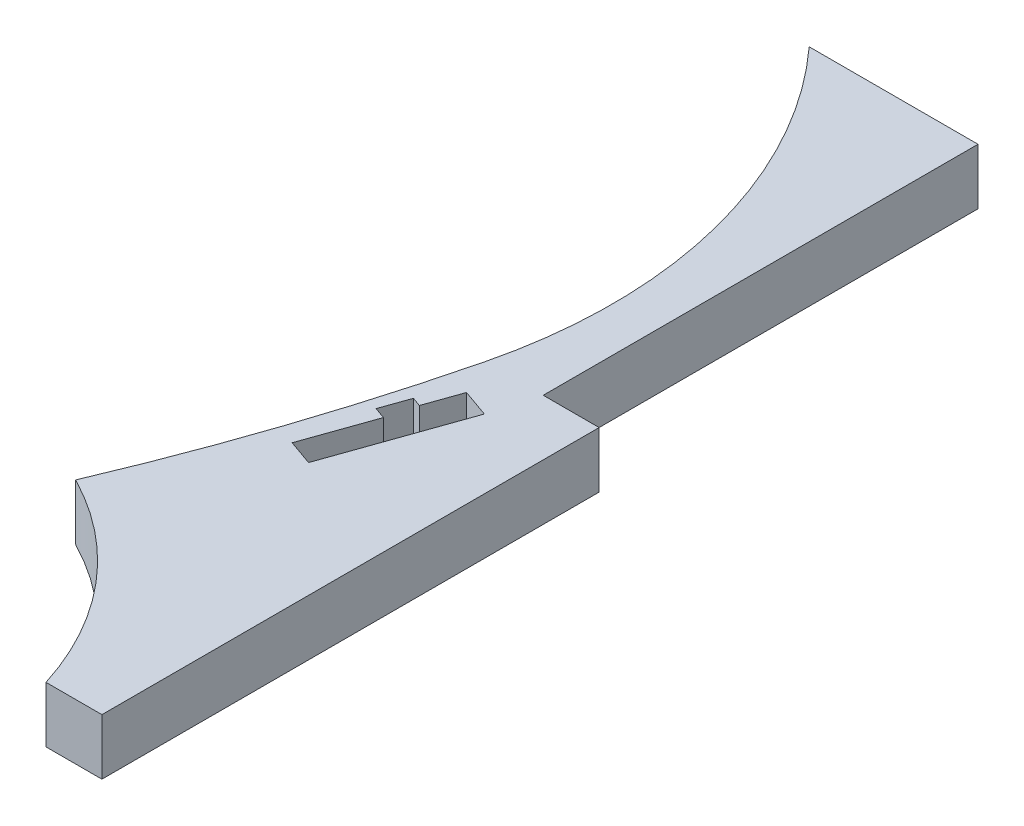
ISO-10303-21;
HEADER;
FILE_DESCRIPTION(('STEP AP214'),'2;1');
FILE_NAME('part.step','',(''),(''),'','','');
FILE_SCHEMA(('AUTOMOTIVE_DESIGN { 1 0 10303 214 1 1 1 1 }'));
ENDSEC;
DATA;
#1=APPLICATION_CONTEXT('core data for automotive mechanical design processes');
#2=APPLICATION_PROTOCOL_DEFINITION('international standard','automotive_design',2000,#1);
#3=PRODUCT_CONTEXT('',#1,'mechanical');
#4=PRODUCT('Part','Part','',(#3));
#5=PRODUCT_RELATED_PRODUCT_CATEGORY('part','',(#4));
#6=PRODUCT_DEFINITION_FORMATION('','',#4);
#7=PRODUCT_DEFINITION_CONTEXT('part definition',#1,'design');
#8=PRODUCT_DEFINITION('design','',#6,#7);
#9=PRODUCT_DEFINITION_SHAPE('','',#8);
#10=(LENGTH_UNIT() NAMED_UNIT(*) SI_UNIT(.MILLI.,.METRE.));
#11=(NAMED_UNIT(*) PLANE_ANGLE_UNIT() SI_UNIT($,.RADIAN.));
#12=(NAMED_UNIT(*) SI_UNIT($,.STERADIAN.) SOLID_ANGLE_UNIT());
#13=UNCERTAINTY_MEASURE_WITH_UNIT(LENGTH_MEASURE(1.E-05),#10,'distance_accuracy_value','');
#14=(GEOMETRIC_REPRESENTATION_CONTEXT(3) GLOBAL_UNCERTAINTY_ASSIGNED_CONTEXT((#13)) GLOBAL_UNIT_ASSIGNED_CONTEXT((#10,
#11,#12)) REPRESENTATION_CONTEXT('',''));
#15=CARTESIAN_POINT('',(0.,0.,0.));
#16=DIRECTION('',(0.,0.,1.));
#17=DIRECTION('',(1.,0.,0.));
#18=AXIS2_PLACEMENT_3D('',#15,#16,#17);
#19=CARTESIAN_POINT('',(-123.824999999997,19.05,32.9878065635989));
#20=DIRECTION('',(0.,-1.,0.));
#21=DIRECTION('',(0.,0.,-1.));
#22=AXIS2_PLACEMENT_3D('',#19,#20,#21);
#23=CYLINDRICAL_SURFACE('',#22,109.845327651549);
#24=CARTESIAN_POINT('',(-123.824999999997,0.,32.9878065635989));
#25=DIRECTION('',(0.,-1.,0.));
#26=DIRECTION('',(0.,0.,-1.));
#27=AXIS2_PLACEMENT_3D('',#24,#25,#26);
#28=CIRCLE('',#27,109.845327651549);
#29=CARTESIAN_POINT('',(-73.7224108953443,0.,-64.7655901645279));
#30=VERTEX_POINT('',#29);
#31=CARTESIAN_POINT('',(-19.0500000000028,0.,0.));
#32=VERTEX_POINT('',#31);
#33=EDGE_CURVE('E226',#30,#32,#28,.T.);
#34=ORIENTED_EDGE('',*,*,#33,.T.);
#35=DIRECTION('',(0.,-1.,0.));
#36=VECTOR('',#35,1.);
#37=CARTESIAN_POINT('',(-19.0500000000028,19.05,0.));
#38=LINE('',#37,#36);
#39=CARTESIAN_POINT('',(-19.0500000000028,19.05,0.));
#40=VERTEX_POINT('',#39);
#41=EDGE_CURVE('E11',#40,#32,#38,.T.);
#42=ORIENTED_EDGE('',*,*,#41,.F.);
#43=CARTESIAN_POINT('',(-123.824999999997,19.05,32.9878065635989));
#44=DIRECTION('',(0.,-1.,0.));
#45=DIRECTION('',(0.,0.,-1.));
#46=AXIS2_PLACEMENT_3D('',#43,#44,#45);
#47=CIRCLE('',#46,109.845327651549);
#48=CARTESIAN_POINT('',(-73.7224108953443,19.05,-64.7655901645279));
#49=VERTEX_POINT('',#48);
#50=EDGE_CURVE('E240',#49,#40,#47,.T.);
#51=ORIENTED_EDGE('',*,*,#50,.F.);
#52=DIRECTION('',(0.,-1.,0.));
#53=VECTOR('',#52,1.);
#54=CARTESIAN_POINT('',(-73.7224108953443,19.05,-64.7655901645279));
#55=LINE('',#54,#53);
#56=EDGE_CURVE('E258',#49,#30,#55,.T.);
#57=ORIENTED_EDGE('',*,*,#56,.T.);
#58=EDGE_LOOP('',(#34,#42,#51,#57));
#59=FACE_BOUND('',#58,.T.);
#60=ADVANCED_FACE('F33',(#59),#23,.F.);
#61=CARTESIAN_POINT('',(-19.0500000000028,19.05,0.));
#62=DIRECTION('',(0.,0.,-1.));
#63=DIRECTION('',(-1.,0.,0.));
#64=AXIS2_PLACEMENT_3D('',#61,#62,#63);
#65=PLANE('',#64);
#66=DIRECTION('',(1.,0.,0.));
#67=VECTOR('',#66,1.);
#68=CARTESIAN_POINT('',(-19.0500000000028,0.,0.));
#69=LINE('',#68,#67);
#70=CARTESIAN_POINT('',(0.,0.,0.));
#71=VERTEX_POINT('',#70);
#72=EDGE_CURVE('E261',#32,#71,#69,.T.);
#73=ORIENTED_EDGE('',*,*,#72,.T.);
#74=DIRECTION('',(0.,-1.,0.));
#75=VECTOR('',#74,1.);
#76=CARTESIAN_POINT('',(0.,19.05,0.));
#77=LINE('',#76,#75);
#78=CARTESIAN_POINT('',(0.,19.05,0.));
#79=VERTEX_POINT('',#78);
#80=EDGE_CURVE('E40',#79,#71,#77,.T.);
#81=ORIENTED_EDGE('',*,*,#80,.F.);
#82=DIRECTION('',(1.,0.,0.));
#83=VECTOR('',#82,1.);
#84=CARTESIAN_POINT('',(-19.0500000000028,19.05,0.));
#85=LINE('',#84,#83);
#86=EDGE_CURVE('E243',#40,#79,#85,.T.);
#87=ORIENTED_EDGE('',*,*,#86,.F.);
#88=ORIENTED_EDGE('',*,*,#41,.T.);
#89=EDGE_LOOP('',(#73,#81,#87,#88));
#90=FACE_BOUND('',#89,.T.);
#91=ADVANCED_FACE('F318',(#90),#65,.F.);
#92=CARTESIAN_POINT('',(0.,19.05,-169.388632852006));
#93=DIRECTION('',(-1.,0.,0.));
#94=DIRECTION('',(0.,0.,1.));
#95=AXIS2_PLACEMENT_3D('',#92,#93,#94);
#96=PLANE('',#95);
#97=DIRECTION('',(0.,0.,-1.));
#98=VECTOR('',#97,1.);
#99=CARTESIAN_POINT('',(0.,0.,-169.388632852006));
#100=LINE('',#99,#98);
#101=CARTESIAN_POINT('',(0.,0.,-169.388632852006));
#102=VERTEX_POINT('',#101);
#103=EDGE_CURVE('E263',#71,#102,#100,.T.);
#104=ORIENTED_EDGE('',*,*,#103,.T.);
#105=DIRECTION('',(0.,-1.,0.));
#106=VECTOR('',#105,1.);
#107=CARTESIAN_POINT('',(0.,19.05,-169.388632852006));
#108=LINE('',#107,#106);
#109=CARTESIAN_POINT('',(0.,19.05,-169.388632852006));
#110=VERTEX_POINT('',#109);
#111=EDGE_CURVE('E288',#110,#102,#108,.T.);
#112=ORIENTED_EDGE('',*,*,#111,.F.);
#113=DIRECTION('',(0.,0.,-1.));
#114=VECTOR('',#113,1.);
#115=CARTESIAN_POINT('',(0.,19.05,-169.388632852006));
#116=LINE('',#115,#114);
#117=EDGE_CURVE('E246',#79,#110,#116,.T.);
#118=ORIENTED_EDGE('',*,*,#117,.F.);
#119=ORIENTED_EDGE('',*,*,#80,.T.);
#120=EDGE_LOOP('',(#104,#112,#118,#119));
#121=FACE_BOUND('',#120,.T.);
#122=ADVANCED_FACE('F295',(#121),#96,.F.);
#123=CARTESIAN_POINT('',(0.,19.05,-169.388632852006));
#124=DIRECTION('',(0.,0.,1.));
#125=DIRECTION('',(1.,0.,0.));
#126=AXIS2_PLACEMENT_3D('',#123,#124,#125);
#127=PLANE('',#126);
#128=DIRECTION('',(-1.,0.,0.));
#129=VECTOR('',#128,1.);
#130=CARTESIAN_POINT('',(0.,0.,-169.388632852006));
#131=LINE('',#130,#129);
#132=CARTESIAN_POINT('',(-19.0500000000028,0.,-169.388632852006));
#133=VERTEX_POINT('',#132);
#134=EDGE_CURVE('E265',#102,#133,#131,.T.);
#135=ORIENTED_EDGE('',*,*,#134,.T.);
#136=DIRECTION('',(0.,-1.,0.));
#137=VECTOR('',#136,1.);
#138=CARTESIAN_POINT('',(-19.0500000000028,19.05,-169.388632852006));
#139=LINE('',#138,#137);
#140=CARTESIAN_POINT('',(-19.0500000000028,19.05,-169.388632852006));
#141=VERTEX_POINT('',#140);
#142=EDGE_CURVE('E285',#141,#133,#139,.T.);
#143=ORIENTED_EDGE('',*,*,#142,.F.);
#144=DIRECTION('',(-1.,0.,0.));
#145=VECTOR('',#144,1.);
#146=CARTESIAN_POINT('',(0.,19.05,-169.388632852006));
#147=LINE('',#146,#145);
#148=EDGE_CURVE('E248',#110,#141,#147,.T.);
#149=ORIENTED_EDGE('',*,*,#148,.F.);
#150=ORIENTED_EDGE('',*,*,#111,.T.);
#151=EDGE_LOOP('',(#135,#143,#149,#150));
#152=FACE_BOUND('',#151,.T.);
#153=ADVANCED_FACE('F306',(#152),#127,.F.);
#154=CARTESIAN_POINT('',(-19.0500000000028,19.05,-169.388632852006));
#155=DIRECTION('',(-1.,0.,0.));
#156=DIRECTION('',(0.,0.,1.));
#157=AXIS2_PLACEMENT_3D('',#154,#155,#156);
#158=PLANE('',#157);
#159=DIRECTION('',(0.,0.,-1.));
#160=VECTOR('',#159,1.);
#161=CARTESIAN_POINT('',(-19.0500000000028,0.,-169.388632852006));
#162=LINE('',#161,#160);
#163=CARTESIAN_POINT('',(-19.0500000000028,0.,-317.5));
#164=VERTEX_POINT('',#163);
#165=EDGE_CURVE('E267',#133,#164,#162,.T.);
#166=ORIENTED_EDGE('',*,*,#165,.T.);
#167=DIRECTION('',(0.,-1.,0.));
#168=VECTOR('',#167,1.);
#169=CARTESIAN_POINT('',(-19.0500000000028,19.05,-317.5));
#170=LINE('',#169,#168);
#171=CARTESIAN_POINT('',(-19.0500000000028,19.05,-317.5));
#172=VERTEX_POINT('',#171);
#173=EDGE_CURVE('E282',#172,#164,#170,.T.);
#174=ORIENTED_EDGE('',*,*,#173,.F.);
#175=DIRECTION('',(0.,0.,-1.));
#176=VECTOR('',#175,1.);
#177=CARTESIAN_POINT('',(-19.0500000000028,19.05,-169.388632852006));
#178=LINE('',#177,#176);
#179=EDGE_CURVE('E250',#141,#172,#178,.T.);
#180=ORIENTED_EDGE('',*,*,#179,.F.);
#181=ORIENTED_EDGE('',*,*,#142,.T.);
#182=EDGE_LOOP('',(#166,#174,#180,#181));
#183=FACE_BOUND('',#182,.T.);
#184=ADVANCED_FACE('F310',(#183),#158,.F.);
#185=CARTESIAN_POINT('',(-19.0500000000028,19.05,-317.5));
#186=DIRECTION('',(0.,0.,1.));
#187=DIRECTION('',(1.,0.,0.));
#188=AXIS2_PLACEMENT_3D('',#185,#186,#187);
#189=PLANE('',#188);
#190=DIRECTION('',(-1.,0.,0.));
#191=VECTOR('',#190,1.);
#192=CARTESIAN_POINT('',(-19.0500000000028,0.,-317.5));
#193=LINE('',#192,#191);
#194=CARTESIAN_POINT('',(-76.5547912673362,0.,-317.499999999998));
#195=VERTEX_POINT('',#194);
#196=EDGE_CURVE('E269',#164,#195,#193,.T.);
#197=ORIENTED_EDGE('',*,*,#196,.T.);
#198=DIRECTION('',(0.,-1.,0.));
#199=VECTOR('',#198,1.);
#200=CARTESIAN_POINT('',(-76.5547912673362,19.05,-317.499999999998));
#201=LINE('',#200,#199);
#202=CARTESIAN_POINT('',(-76.5547912673362,19.05,-317.499999999998));
#203=VERTEX_POINT('',#202);
#204=EDGE_CURVE('E279',#203,#195,#201,.T.);
#205=ORIENTED_EDGE('',*,*,#204,.F.);
#206=DIRECTION('',(-1.,0.,0.));
#207=VECTOR('',#206,1.);
#208=CARTESIAN_POINT('',(-19.0500000000028,19.05,-317.5));
#209=LINE('',#208,#207);
#210=EDGE_CURVE('E252',#172,#203,#209,.T.);
#211=ORIENTED_EDGE('',*,*,#210,.F.);
#212=ORIENTED_EDGE('',*,*,#173,.T.);
#213=EDGE_LOOP('',(#197,#205,#211,#212));
#214=FACE_BOUND('',#213,.T.);
#215=ADVANCED_FACE('F331',(#214),#189,.F.);
#216=CARTESIAN_POINT('',(-196.510004657738,19.05,-208.136195969553));
#217=DIRECTION('',(0.,-1.,0.));
#218=DIRECTION('',(0.,0.,-1.));
#219=AXIS2_PLACEMENT_3D('',#216,#217,#218);
#220=CYLINDRICAL_SURFACE('',#219,162.325890884808);
#221=CARTESIAN_POINT('',(-196.510004657738,0.,-208.136195969553));
#222=DIRECTION('',(0.,-1.,0.));
#223=DIRECTION('',(0.,0.,1.));
#224=AXIS2_PLACEMENT_3D('',#221,#222,#223);
#225=CIRCLE('',#224,162.325890884808);
#226=CARTESIAN_POINT('',(-38.8765018609086,0.,-169.388632852004));
#227=VERTEX_POINT('',#226);
#228=EDGE_CURVE('E271',#195,#227,#225,.T.);
#229=ORIENTED_EDGE('',*,*,#228,.T.);
#230=DIRECTION('',(0.,-1.,0.));
#231=VECTOR('',#230,1.);
#232=CARTESIAN_POINT('',(-38.8765018609086,19.05,-169.388632852004));
#233=LINE('',#232,#231);
#234=CARTESIAN_POINT('',(-38.8765018609086,19.05,-169.388632852004));
#235=VERTEX_POINT('',#234);
#236=EDGE_CURVE('E276',#235,#227,#233,.T.);
#237=ORIENTED_EDGE('',*,*,#236,.F.);
#238=CARTESIAN_POINT('',(-196.510004657738,19.05,-208.136195969553));
#239=DIRECTION('',(0.,-1.,0.));
#240=DIRECTION('',(0.,0.,1.));
#241=AXIS2_PLACEMENT_3D('',#238,#239,#240);
#242=CIRCLE('',#241,162.325890884808);
#243=EDGE_CURVE('E254',#203,#235,#242,.T.);
#244=ORIENTED_EDGE('',*,*,#243,.F.);
#245=ORIENTED_EDGE('',*,*,#204,.T.);
#246=EDGE_LOOP('',(#229,#237,#244,#245));
#247=FACE_BOUND('',#246,.T.);
#248=ADVANCED_FACE('F329',(#247),#220,.F.);
#249=CARTESIAN_POINT('',(-704.917093121844,19.05,-333.106683842696));
#250=DIRECTION('',(0.,-1.,0.));
#251=DIRECTION('',(0.,0.,-1.));
#252=AXIS2_PLACEMENT_3D('',#249,#250,#251);
#253=CYLINDRICAL_SURFACE('',#252,685.867093121843);
#254=CARTESIAN_POINT('',(-704.917093121844,0.,-333.106683842696));
#255=DIRECTION('',(0.,-1.,0.));
#256=DIRECTION('',(0.,0.,1.));
#257=AXIS2_PLACEMENT_3D('',#254,#255,#256);
#258=CIRCLE('',#257,685.867093121843);
#259=EDGE_CURVE('E244',#227,#30,#258,.T.);
#260=ORIENTED_EDGE('',*,*,#259,.T.);
#261=ORIENTED_EDGE('',*,*,#56,.F.);
#262=CARTESIAN_POINT('',(-704.917093121844,19.05,-333.106683842696));
#263=DIRECTION('',(0.,-1.,0.));
#264=DIRECTION('',(0.,0.,1.));
#265=AXIS2_PLACEMENT_3D('',#262,#263,#264);
#266=CIRCLE('',#265,685.867093121843);
#267=EDGE_CURVE('E256',#235,#49,#266,.T.);
#268=ORIENTED_EDGE('',*,*,#267,.F.);
#269=ORIENTED_EDGE('',*,*,#236,.T.);
#270=EDGE_LOOP('',(#260,#261,#268,#269));
#271=FACE_BOUND('',#270,.T.);
#272=ADVANCED_FACE('F324',(#271),#253,.F.);
#273=CARTESIAN_POINT('',(-123.824999999997,19.05,32.9878065635989));
#274=DIRECTION('',(0.,-1.,0.));
#275=DIRECTION('',(0.,0.,-1.));
#276=AXIS2_PLACEMENT_3D('',#273,#274,#275);
#277=PLANE('',#276);
#278=DIRECTION('',(-0.332782108184803,0.,0.943003747856857));
#279=VECTOR('',#278,1.);
#280=CARTESIAN_POINT('',(-40.2708944301093,19.05,-146.382292029943));
#281=LINE('',#280,#279);
#282=CARTESIAN_POINT('',(-40.2708944301093,19.05,-146.382292029943));
#283=VERTEX_POINT('',#282);
#284=CARTESIAN_POINT('',(-43.5885656576577,19.05,-136.981016165684));
#285=VERTEX_POINT('',#284);
#286=EDGE_CURVE('E204',#283,#285,#281,.T.);
#287=ORIENTED_EDGE('',*,*,#286,.F.);
#288=DIRECTION('',(-0.943003747856855,0.,-0.332782108184809));
#289=VECTOR('',#288,1.);
#290=CARTESIAN_POINT('',(-37.1331437594904,19.05,-145.274992843169));
#291=LINE('',#290,#289);
#292=CARTESIAN_POINT('',(-37.1331437594904,19.05,-145.274992843169));
#293=VERTEX_POINT('',#292);
#294=EDGE_CURVE('E47',#293,#283,#291,.T.);
#295=ORIENTED_EDGE('',*,*,#294,.F.);
#296=DIRECTION('',(-0.332782108184804,0.,0.943003747856856));
#297=VECTOR('',#296,1.);
#298=CARTESIAN_POINT('',(-32.9448479805089,19.05,-157.143355112571));
#299=LINE('',#298,#297);
#300=CARTESIAN_POINT('',(-32.9448479805089,19.05,-157.143355112571));
#301=VERTEX_POINT('',#300);
#302=EDGE_CURVE('E183',#301,#293,#299,.T.);
#303=ORIENTED_EDGE('',*,*,#302,.F.);
#304=DIRECTION('',(-0.943003747856857,0.,-0.332782108184803));
#305=VECTOR('',#304,1.);
#306=CARTESIAN_POINT('',(-23.54357211625,19.05,-153.825683885023));
#307=LINE('',#306,#305);
#308=CARTESIAN_POINT('',(-23.54357211625,19.05,-153.825683885023));
#309=VERTEX_POINT('',#308);
#310=EDGE_CURVE('E219',#309,#301,#307,.T.);
#311=ORIENTED_EDGE('',*,*,#310,.F.);
#312=DIRECTION('',(0.332782108184804,0.,-0.943003747856856));
#313=VECTOR('',#312,1.);
#314=CARTESIAN_POINT('',(-39.1640980487581,19.05,-109.56184236362));
#315=LINE('',#314,#313);
#316=CARTESIAN_POINT('',(-39.1640980487581,19.05,-109.56184236362));
#317=VERTEX_POINT('',#316);
#318=EDGE_CURVE('E216',#317,#309,#315,.T.);
#319=ORIENTED_EDGE('',*,*,#318,.F.);
#320=DIRECTION('',(0.943003747856856,0.,0.332782108184804));
#321=VECTOR('',#320,1.);
#322=CARTESIAN_POINT('',(-47.8108766143568,19.05,-112.61325462641));
#323=LINE('',#322,#321);
#324=CARTESIAN_POINT('',(-47.8108766143568,19.05,-112.61325462641));
#325=VERTEX_POINT('',#324);
#326=EDGE_CURVE('E213',#325,#317,#323,.T.);
#327=ORIENTED_EDGE('',*,*,#326,.F.);
#328=DIRECTION('',(-0.332782108184804,0.,0.943003747856857));
#329=VECTOR('',#328,1.);
#330=CARTESIAN_POINT('',(-39.6963176883785,19.05,-135.607458014152));
#331=LINE('',#330,#329);
#332=CARTESIAN_POINT('',(-39.6963176883785,19.05,-135.607458014152));
#333=VERTEX_POINT('',#332);
#334=EDGE_CURVE('E210',#333,#325,#331,.T.);
#335=ORIENTED_EDGE('',*,*,#334,.F.);
#336=DIRECTION('',(0.943003747856858,0.,0.332782108184799));
#337=VECTOR('',#336,1.);
#338=CARTESIAN_POINT('',(-43.5885656576577,19.05,-136.981016165684));
#339=LINE('',#338,#337);
#340=EDGE_CURVE('E207',#285,#333,#339,.T.);
#341=ORIENTED_EDGE('',*,*,#340,.F.);
#342=EDGE_LOOP('',(#287,#295,#303,#311,#319,#327,#335,#341));
#343=FACE_BOUND('',#342,.T.);
#344=ORIENTED_EDGE('',*,*,#50,.T.);
#345=ORIENTED_EDGE('',*,*,#86,.T.);
#346=ORIENTED_EDGE('',*,*,#117,.T.);
#347=ORIENTED_EDGE('',*,*,#148,.T.);
#348=ORIENTED_EDGE('',*,*,#179,.T.);
#349=ORIENTED_EDGE('',*,*,#210,.T.);
#350=ORIENTED_EDGE('',*,*,#243,.T.);
#351=ORIENTED_EDGE('',*,*,#267,.T.);
#352=EDGE_LOOP('',(#344,#345,#346,#347,#348,#349,#350,#351));
#353=FACE_BOUND('',#352,.T.);
#354=ADVANCED_FACE('F314',(#343,#353),#277,.F.);
#355=CARTESIAN_POINT('',(-123.824999999997,0.,32.9878065635989));
#356=DIRECTION('',(0.,-1.,0.));
#357=DIRECTION('',(0.,0.,-1.));
#358=AXIS2_PLACEMENT_3D('',#355,#356,#357);
#359=PLANE('',#358);
#360=CARTESIAN_POINT('',(-12.7000000000014,0.,-28.575));
#361=DIRECTION('',(0.,-1.,0.));
#362=DIRECTION('',(0.,0.,-1.));
#363=AXIS2_PLACEMENT_3D('',#360,#361,#362);
#364=CIRCLE('',#363,1.58749999999999);
#365=CARTESIAN_POINT('',(-12.7000000000014,0.,-30.1625));
#366=VERTEX_POINT('',#365);
#367=EDGE_CURVE('E163',#366,#366,#364,.T.);
#368=ORIENTED_EDGE('',*,*,#367,.F.);
#369=EDGE_LOOP('',(#368));
#370=FACE_BOUND('',#369,.T.);
#371=CARTESIAN_POINT('',(-38.3632194654803,0.,-73.025));
#372=DIRECTION('',(0.,-1.,0.));
#373=DIRECTION('',(0.,0.,-1.));
#374=AXIS2_PLACEMENT_3D('',#371,#372,#373);
#375=CIRCLE('',#374,1.58749999999999);
#376=CARTESIAN_POINT('',(-38.3632194654803,0.,-74.6125));
#377=VERTEX_POINT('',#376);
#378=EDGE_CURVE('E162',#377,#377,#375,.T.);
#379=ORIENTED_EDGE('',*,*,#378,.F.);
#380=EDGE_LOOP('',(#379));
#381=FACE_BOUND('',#380,.T.);
#382=CARTESIAN_POINT('',(-38.3632194654803,0.,-300.0375));
#383=DIRECTION('',(0.,-1.,0.));
#384=DIRECTION('',(0.,0.,-1.));
#385=AXIS2_PLACEMENT_3D('',#382,#383,#384);
#386=CIRCLE('',#385,1.58749999999999);
#387=CARTESIAN_POINT('',(-38.3632194654803,0.,-301.625));
#388=VERTEX_POINT('',#387);
#389=EDGE_CURVE('E173',#388,#388,#386,.T.);
#390=ORIENTED_EDGE('',*,*,#389,.F.);
#391=EDGE_LOOP('',(#390));
#392=FACE_BOUND('',#391,.T.);
#393=DIRECTION('',(-0.943003747856855,0.,-0.332782108184809));
#394=VECTOR('',#393,1.);
#395=CARTESIAN_POINT('',(-37.1331437594904,0.,-145.274992843169));
#396=LINE('',#395,#394);
#397=CARTESIAN_POINT('',(-37.1331437594904,0.,-145.274992843169));
#398=VERTEX_POINT('',#397);
#399=CARTESIAN_POINT('',(-40.2708944301093,0.,-146.382292029943));
#400=VERTEX_POINT('',#399);
#401=EDGE_CURVE('E179',#398,#400,#396,.T.);
#402=ORIENTED_EDGE('',*,*,#401,.T.);
#403=DIRECTION('',(-0.332782108184803,0.,0.943003747856857));
#404=VECTOR('',#403,1.);
#405=CARTESIAN_POINT('',(-40.2708944301093,0.,-146.382292029943));
#406=LINE('',#405,#404);
#407=CARTESIAN_POINT('',(-43.5885656576577,0.,-136.981016165684));
#408=VERTEX_POINT('',#407);
#409=EDGE_CURVE('E182',#400,#408,#406,.T.);
#410=ORIENTED_EDGE('',*,*,#409,.T.);
#411=DIRECTION('',(0.943003747856858,0.,0.332782108184799));
#412=VECTOR('',#411,1.);
#413=CARTESIAN_POINT('',(-43.5885656576577,0.,-136.981016165684));
#414=LINE('',#413,#412);
#415=CARTESIAN_POINT('',(-39.6963176883785,0.,-135.607458014152));
#416=VERTEX_POINT('',#415);
#417=EDGE_CURVE('E55',#408,#416,#414,.T.);
#418=ORIENTED_EDGE('',*,*,#417,.T.);
#419=DIRECTION('',(-0.332782108184804,0.,0.943003747856857));
#420=VECTOR('',#419,1.);
#421=CARTESIAN_POINT('',(-39.6963176883785,0.,-135.607458014152));
#422=LINE('',#421,#420);
#423=CARTESIAN_POINT('',(-47.8108766143568,0.,-112.61325462641));
#424=VERTEX_POINT('',#423);
#425=EDGE_CURVE('E187',#416,#424,#422,.T.);
#426=ORIENTED_EDGE('',*,*,#425,.T.);
#427=DIRECTION('',(0.943003747856856,0.,0.332782108184804));
#428=VECTOR('',#427,1.);
#429=CARTESIAN_POINT('',(-47.8108766143568,0.,-112.61325462641));
#430=LINE('',#429,#428);
#431=CARTESIAN_POINT('',(-39.1640980487581,0.,-109.56184236362));
#432=VERTEX_POINT('',#431);
#433=EDGE_CURVE('E190',#424,#432,#430,.T.);
#434=ORIENTED_EDGE('',*,*,#433,.T.);
#435=DIRECTION('',(0.332782108184804,0.,-0.943003747856856));
#436=VECTOR('',#435,1.);
#437=CARTESIAN_POINT('',(-39.1640980487581,0.,-109.56184236362));
#438=LINE('',#437,#436);
#439=CARTESIAN_POINT('',(-23.54357211625,0.,-153.825683885023));
#440=VERTEX_POINT('',#439);
#441=EDGE_CURVE('E193',#432,#440,#438,.T.);
#442=ORIENTED_EDGE('',*,*,#441,.T.);
#443=DIRECTION('',(-0.943003747856857,0.,-0.332782108184803));
#444=VECTOR('',#443,1.);
#445=CARTESIAN_POINT('',(-23.54357211625,0.,-153.825683885023));
#446=LINE('',#445,#444);
#447=CARTESIAN_POINT('',(-32.9448479805089,0.,-157.143355112571));
#448=VERTEX_POINT('',#447);
#449=EDGE_CURVE('E196',#440,#448,#446,.T.);
#450=ORIENTED_EDGE('',*,*,#449,.T.);
#451=DIRECTION('',(-0.332782108184804,0.,0.943003747856856));
#452=VECTOR('',#451,1.);
#453=CARTESIAN_POINT('',(-32.9448479805089,0.,-157.143355112571));
#454=LINE('',#453,#452);
#455=EDGE_CURVE('E199',#448,#398,#454,.T.);
#456=ORIENTED_EDGE('',*,*,#455,.T.);
#457=EDGE_LOOP('',(#402,#410,#418,#426,#434,#442,#450,#456));
#458=FACE_BOUND('',#457,.T.);
#459=ORIENTED_EDGE('',*,*,#33,.F.);
#460=ORIENTED_EDGE('',*,*,#259,.F.);
#461=ORIENTED_EDGE('',*,*,#228,.F.);
#462=ORIENTED_EDGE('',*,*,#196,.F.);
#463=ORIENTED_EDGE('',*,*,#165,.F.);
#464=ORIENTED_EDGE('',*,*,#134,.F.);
#465=ORIENTED_EDGE('',*,*,#103,.F.);
#466=ORIENTED_EDGE('',*,*,#72,.F.);
#467=EDGE_LOOP('',(#459,#460,#461,#462,#463,#464,#465,#466));
#468=FACE_BOUND('',#467,.T.);
#469=ADVANCED_FACE('F301',(#370,#381,#392,#458,#468),#359,.T.);
#470=CARTESIAN_POINT('',(-37.1331437594904,0.,-145.274992843169));
#471=DIRECTION('',(0.332782108184809,0.,-0.943003747856855));
#472=DIRECTION('',(-0.943003747856855,0.,-0.332782108184809));
#473=AXIS2_PLACEMENT_3D('',#470,#471,#472);
#474=PLANE('',#473);
#475=ORIENTED_EDGE('',*,*,#294,.T.);
#476=DIRECTION('',(0.,1.,0.));
#477=VECTOR('',#476,1.);
#478=CARTESIAN_POINT('',(-40.2708944301093,0.,-146.382292029943));
#479=LINE('',#478,#477);
#480=EDGE_CURVE('E202',#400,#283,#479,.T.);
#481=ORIENTED_EDGE('',*,*,#480,.F.);
#482=ORIENTED_EDGE('',*,*,#401,.F.);
#483=DIRECTION('',(0.,1.,0.));
#484=VECTOR('',#483,1.);
#485=CARTESIAN_POINT('',(-37.1331437594904,0.,-145.274992843169));
#486=LINE('',#485,#484);
#487=EDGE_CURVE('E224',#398,#293,#486,.T.);
#488=ORIENTED_EDGE('',*,*,#487,.T.);
#489=EDGE_LOOP('',(#475,#481,#482,#488));
#490=FACE_BOUND('',#489,.T.);
#491=ADVANCED_FACE('F392',(#490),#474,.F.);
#492=CARTESIAN_POINT('',(-32.9448479805089,0.,-157.143355112571));
#493=DIRECTION('',(-0.943003747856856,0.,-0.332782108184804));
#494=DIRECTION('',(-0.332782108184804,0.,0.943003747856856));
#495=AXIS2_PLACEMENT_3D('',#492,#493,#494);
#496=PLANE('',#495);
#497=ORIENTED_EDGE('',*,*,#302,.T.);
#498=ORIENTED_EDGE('',*,*,#487,.F.);
#499=ORIENTED_EDGE('',*,*,#455,.F.);
#500=DIRECTION('',(0.,1.,0.));
#501=VECTOR('',#500,1.);
#502=CARTESIAN_POINT('',(-32.9448479805089,0.,-157.143355112571));
#503=LINE('',#502,#501);
#504=EDGE_CURVE('E227',#448,#301,#503,.T.);
#505=ORIENTED_EDGE('',*,*,#504,.T.);
#506=EDGE_LOOP('',(#497,#498,#499,#505));
#507=FACE_BOUND('',#506,.T.);
#508=ADVANCED_FACE('F397',(#507),#496,.F.);
#509=CARTESIAN_POINT('',(-23.54357211625,0.,-153.825683885023));
#510=DIRECTION('',(0.332782108184803,0.,-0.943003747856857));
#511=DIRECTION('',(-0.943003747856857,0.,-0.332782108184803));
#512=AXIS2_PLACEMENT_3D('',#509,#510,#511);
#513=PLANE('',#512);
#514=ORIENTED_EDGE('',*,*,#310,.T.);
#515=ORIENTED_EDGE('',*,*,#504,.F.);
#516=ORIENTED_EDGE('',*,*,#449,.F.);
#517=DIRECTION('',(0.,1.,0.));
#518=VECTOR('',#517,1.);
#519=CARTESIAN_POINT('',(-23.54357211625,0.,-153.825683885023));
#520=LINE('',#519,#518);
#521=EDGE_CURVE('E229',#440,#309,#520,.T.);
#522=ORIENTED_EDGE('',*,*,#521,.T.);
#523=EDGE_LOOP('',(#514,#515,#516,#522));
#524=FACE_BOUND('',#523,.T.);
#525=ADVANCED_FACE('F406',(#524),#513,.F.);
#526=CARTESIAN_POINT('',(-39.1640980487581,0.,-109.56184236362));
#527=DIRECTION('',(0.943003747856856,0.,0.332782108184804));
#528=DIRECTION('',(0.332782108184804,0.,-0.943003747856856));
#529=AXIS2_PLACEMENT_3D('',#526,#527,#528);
#530=PLANE('',#529);
#531=ORIENTED_EDGE('',*,*,#318,.T.);
#532=ORIENTED_EDGE('',*,*,#521,.F.);
#533=ORIENTED_EDGE('',*,*,#441,.F.);
#534=DIRECTION('',(0.,1.,0.));
#535=VECTOR('',#534,1.);
#536=CARTESIAN_POINT('',(-39.1640980487581,0.,-109.56184236362));
#537=LINE('',#536,#535);
#538=EDGE_CURVE('E231',#432,#317,#537,.T.);
#539=ORIENTED_EDGE('',*,*,#538,.T.);
#540=EDGE_LOOP('',(#531,#532,#533,#539));
#541=FACE_BOUND('',#540,.T.);
#542=ADVANCED_FACE('F416',(#541),#530,.F.);
#543=CARTESIAN_POINT('',(-47.8108766143568,0.,-112.61325462641));
#544=DIRECTION('',(-0.332782108184804,0.,0.943003747856856));
#545=DIRECTION('',(0.943003747856856,0.,0.332782108184804));
#546=AXIS2_PLACEMENT_3D('',#543,#544,#545);
#547=PLANE('',#546);
#548=ORIENTED_EDGE('',*,*,#326,.T.);
#549=ORIENTED_EDGE('',*,*,#538,.F.);
#550=ORIENTED_EDGE('',*,*,#433,.F.);
#551=DIRECTION('',(0.,1.,0.));
#552=VECTOR('',#551,1.);
#553=CARTESIAN_POINT('',(-47.8108766143568,0.,-112.61325462641));
#554=LINE('',#553,#552);
#555=EDGE_CURVE('E233',#424,#325,#554,.T.);
#556=ORIENTED_EDGE('',*,*,#555,.T.);
#557=EDGE_LOOP('',(#548,#549,#550,#556));
#558=FACE_BOUND('',#557,.T.);
#559=ADVANCED_FACE('F426',(#558),#547,.F.);
#560=CARTESIAN_POINT('',(-39.6963176883785,0.,-135.607458014152));
#561=DIRECTION('',(-0.943003747856856,0.,-0.332782108184804));
#562=DIRECTION('',(-0.332782108184804,0.,0.943003747856857));
#563=AXIS2_PLACEMENT_3D('',#560,#561,#562);
#564=PLANE('',#563);
#565=ORIENTED_EDGE('',*,*,#334,.T.);
#566=ORIENTED_EDGE('',*,*,#555,.F.);
#567=ORIENTED_EDGE('',*,*,#425,.F.);
#568=DIRECTION('',(0.,1.,0.));
#569=VECTOR('',#568,1.);
#570=CARTESIAN_POINT('',(-39.6963176883785,0.,-135.607458014152));
#571=LINE('',#570,#569);
#572=EDGE_CURVE('E235',#416,#333,#571,.T.);
#573=ORIENTED_EDGE('',*,*,#572,.T.);
#574=EDGE_LOOP('',(#565,#566,#567,#573));
#575=FACE_BOUND('',#574,.T.);
#576=ADVANCED_FACE('F436',(#575),#564,.F.);
#577=CARTESIAN_POINT('',(-43.5885656576577,0.,-136.981016165684));
#578=DIRECTION('',(-0.332782108184799,0.,0.943003747856858));
#579=DIRECTION('',(0.943003747856858,0.,0.332782108184799));
#580=AXIS2_PLACEMENT_3D('',#577,#578,#579);
#581=PLANE('',#580);
#582=ORIENTED_EDGE('',*,*,#340,.T.);
#583=ORIENTED_EDGE('',*,*,#572,.F.);
#584=ORIENTED_EDGE('',*,*,#417,.F.);
#585=DIRECTION('',(0.,1.,0.));
#586=VECTOR('',#585,1.);
#587=CARTESIAN_POINT('',(-43.5885656576577,0.,-136.981016165684));
#588=LINE('',#587,#586);
#589=EDGE_CURVE('E237',#408,#285,#588,.T.);
#590=ORIENTED_EDGE('',*,*,#589,.T.);
#591=EDGE_LOOP('',(#582,#583,#584,#590));
#592=FACE_BOUND('',#591,.T.);
#593=ADVANCED_FACE('F446',(#592),#581,.F.);
#594=CARTESIAN_POINT('',(-40.2708944301093,0.,-146.382292029943));
#595=DIRECTION('',(-0.943003747856857,0.,-0.332782108184803));
#596=DIRECTION('',(-0.332782108184803,0.,0.943003747856857));
#597=AXIS2_PLACEMENT_3D('',#594,#595,#596);
#598=PLANE('',#597);
#599=ORIENTED_EDGE('',*,*,#286,.T.);
#600=ORIENTED_EDGE('',*,*,#589,.F.);
#601=ORIENTED_EDGE('',*,*,#409,.F.);
#602=ORIENTED_EDGE('',*,*,#480,.T.);
#603=EDGE_LOOP('',(#599,#600,#601,#602));
#604=FACE_BOUND('',#603,.T.);
#605=ADVANCED_FACE('F456',(#604),#598,.F.);
#606=CARTESIAN_POINT('',(-38.3632194654803,11.1252,-300.0375));
#607=DIRECTION('',(0.,-1.,0.));
#608=DIRECTION('',(0.,0.,-1.));
#609=AXIS2_PLACEMENT_3D('',#606,#607,#608);
#610=CONICAL_SURFACE('',#609,1.58749999999999,1.02974425867665);
#611=CARTESIAN_POINT('',(-38.3632194654803,12.0790662327063,-300.0375));
#612=VERTEX_POINT('',#611);
#613=VERTEX_LOOP('',#612);
#614=FACE_BOUND('',#613,.T.);
#615=CARTESIAN_POINT('',(-38.3632194654803,11.1252,-300.0375));
#616=DIRECTION('',(0.,-1.,0.));
#617=DIRECTION('',(0.,0.,-1.));
#618=AXIS2_PLACEMENT_3D('',#615,#616,#617);
#619=CIRCLE('',#618,1.58749999999999);
#620=CARTESIAN_POINT('',(-38.3632194654803,11.1252,-301.625));
#621=VERTEX_POINT('',#620);
#622=EDGE_CURVE('E176',#621,#621,#619,.T.);
#623=ORIENTED_EDGE('',*,*,#622,.T.);
#624=EDGE_LOOP('',(#623));
#625=FACE_BOUND('',#624,.T.);
#626=ADVANCED_FACE('F465',(#614,#625),#610,.F.);
#627=CARTESIAN_POINT('',(-38.3632194654803,0.,-300.0375));
#628=DIRECTION('',(0.,-1.,0.));
#629=DIRECTION('',(0.,0.,-1.));
#630=AXIS2_PLACEMENT_3D('',#627,#628,#629);
#631=CYLINDRICAL_SURFACE('',#630,1.58749999999999);
#632=ORIENTED_EDGE('',*,*,#622,.F.);
#633=EDGE_LOOP('',(#632));
#634=FACE_BOUND('',#633,.T.);
#635=ORIENTED_EDGE('',*,*,#389,.T.);
#636=EDGE_LOOP('',(#635));
#637=FACE_BOUND('',#636,.T.);
#638=ADVANCED_FACE('F482',(#634,#637),#631,.F.);
#639=CARTESIAN_POINT('',(-38.3632194654803,11.1252,-73.025));
#640=DIRECTION('',(0.,-1.,0.));
#641=DIRECTION('',(0.,0.,-1.));
#642=AXIS2_PLACEMENT_3D('',#639,#640,#641);
#643=CONICAL_SURFACE('',#642,1.58749999999999,1.02974425867665);
#644=CARTESIAN_POINT('',(-38.3632194654803,12.0790662327063,-73.025));
#645=VERTEX_POINT('',#644);
#646=VERTEX_LOOP('',#645);
#647=FACE_BOUND('',#646,.T.);
#648=CARTESIAN_POINT('',(-38.3632194654803,11.1252,-73.025));
#649=DIRECTION('',(0.,-1.,0.));
#650=DIRECTION('',(0.,0.,-1.));
#651=AXIS2_PLACEMENT_3D('',#648,#649,#650);
#652=CIRCLE('',#651,1.58749999999999);
#653=CARTESIAN_POINT('',(-38.3632194654803,11.1252,-74.6125));
#654=VERTEX_POINT('',#653);
#655=EDGE_CURVE('E166',#654,#654,#652,.T.);
#656=ORIENTED_EDGE('',*,*,#655,.T.);
#657=EDGE_LOOP('',(#656));
#658=FACE_BOUND('',#657,.T.);
#659=ADVANCED_FACE('F492',(#647,#658),#643,.F.);
#660=CARTESIAN_POINT('',(-38.3632194654803,0.,-73.025));
#661=DIRECTION('',(0.,-1.,0.));
#662=DIRECTION('',(0.,0.,-1.));
#663=AXIS2_PLACEMENT_3D('',#660,#661,#662);
#664=CYLINDRICAL_SURFACE('',#663,1.58749999999999);
#665=ORIENTED_EDGE('',*,*,#655,.F.);
#666=EDGE_LOOP('',(#665));
#667=FACE_BOUND('',#666,.T.);
#668=ORIENTED_EDGE('',*,*,#378,.T.);
#669=EDGE_LOOP('',(#668));
#670=FACE_BOUND('',#669,.T.);
#671=ADVANCED_FACE('F156',(#667,#670),#664,.F.);
#672=CARTESIAN_POINT('',(-12.7000000000014,11.1252,-28.575));
#673=DIRECTION('',(0.,-1.,0.));
#674=DIRECTION('',(0.,0.,-1.));
#675=AXIS2_PLACEMENT_3D('',#672,#673,#674);
#676=CONICAL_SURFACE('',#675,1.58749999999999,1.02974425867665);
#677=CARTESIAN_POINT('',(-12.7000000000014,12.0790662327063,-28.575));
#678=VERTEX_POINT('',#677);
#679=VERTEX_LOOP('',#678);
#680=FACE_BOUND('',#679,.T.);
#681=CARTESIAN_POINT('',(-12.7000000000014,11.1252,-28.575));
#682=DIRECTION('',(0.,-1.,0.));
#683=DIRECTION('',(0.,0.,-1.));
#684=AXIS2_PLACEMENT_3D('',#681,#682,#683);
#685=CIRCLE('',#684,1.58749999999999);
#686=CARTESIAN_POINT('',(-12.7000000000014,11.1252,-30.1625));
#687=VERTEX_POINT('',#686);
#688=EDGE_CURVE('E160',#687,#687,#685,.T.);
#689=ORIENTED_EDGE('',*,*,#688,.T.);
#690=EDGE_LOOP('',(#689));
#691=FACE_BOUND('',#690,.T.);
#692=ADVANCED_FACE('F152',(#680,#691),#676,.F.);
#693=CARTESIAN_POINT('',(-12.7000000000014,0.,-28.575));
#694=DIRECTION('',(0.,-1.,0.));
#695=DIRECTION('',(0.,0.,-1.));
#696=AXIS2_PLACEMENT_3D('',#693,#694,#695);
#697=CYLINDRICAL_SURFACE('',#696,1.58749999999999);
#698=ORIENTED_EDGE('',*,*,#688,.F.);
#699=EDGE_LOOP('',(#698));
#700=FACE_BOUND('',#699,.T.);
#701=ORIENTED_EDGE('',*,*,#367,.T.);
#702=EDGE_LOOP('',(#701));
#703=FACE_BOUND('',#702,.T.);
#704=ADVANCED_FACE('F155',(#700,#703),#697,.F.);
#705=CLOSED_SHELL('',(#60,#91,#122,#153,#184,#215,#248,#272,#354,#469,#491,#508,#525,#542,#559,
#576,#593,#605,#626,#638,#659,#671,#692,#704));
#706=MANIFOLD_SOLID_BREP('B2',#705);
#707=ADVANCED_BREP_SHAPE_REPRESENTATION('',(#18,#706),#14);
#708=SHAPE_DEFINITION_REPRESENTATION(#9,#707);
ENDSEC;
END-ISO-10303-21;
